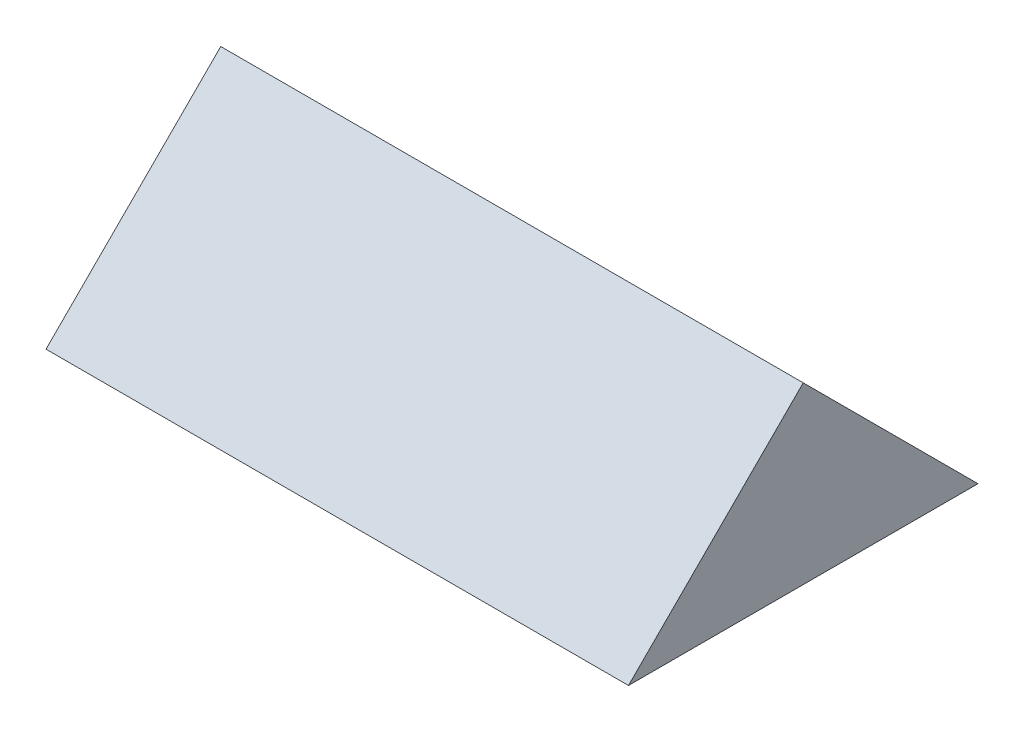
ISO-10303-21;
HEADER;
FILE_DESCRIPTION(('STEP AP214'),'2;1');
FILE_NAME('part.step','',(''),(''),'','','');
FILE_SCHEMA(('AUTOMOTIVE_DESIGN { 1 0 10303 214 1 1 1 1 }'));
ENDSEC;
DATA;
#1=APPLICATION_CONTEXT('core data for automotive mechanical design processes');
#2=APPLICATION_PROTOCOL_DEFINITION('international standard','automotive_design',2000,#1);
#3=PRODUCT_CONTEXT('',#1,'mechanical');
#4=PRODUCT('Part','Part','',(#3));
#5=PRODUCT_RELATED_PRODUCT_CATEGORY('part','',(#4));
#6=PRODUCT_DEFINITION_FORMATION('','',#4);
#7=PRODUCT_DEFINITION_CONTEXT('part definition',#1,'design');
#8=PRODUCT_DEFINITION('design','',#6,#7);
#9=PRODUCT_DEFINITION_SHAPE('','',#8);
#10=(LENGTH_UNIT() NAMED_UNIT(*) SI_UNIT(.MILLI.,.METRE.));
#11=(NAMED_UNIT(*) PLANE_ANGLE_UNIT() SI_UNIT($,.RADIAN.));
#12=(NAMED_UNIT(*) SI_UNIT($,.STERADIAN.) SOLID_ANGLE_UNIT());
#13=UNCERTAINTY_MEASURE_WITH_UNIT(LENGTH_MEASURE(1.E-05),#10,'distance_accuracy_value','');
#14=(GEOMETRIC_REPRESENTATION_CONTEXT(3) GLOBAL_UNCERTAINTY_ASSIGNED_CONTEXT((#13)) GLOBAL_UNIT_ASSIGNED_CONTEXT((#10,
#11,#12)) REPRESENTATION_CONTEXT('',''));
#15=CARTESIAN_POINT('',(0.,0.,0.));
#16=DIRECTION('',(0.,0.,1.));
#17=DIRECTION('',(1.,0.,0.));
#18=AXIS2_PLACEMENT_3D('',#15,#16,#17);
#19=CARTESIAN_POINT('',(12192.,0.,0.));
#20=DIRECTION('',(0.,1.,0.));
#21=DIRECTION('',(0.,0.,1.));
#22=AXIS2_PLACEMENT_3D('',#19,#20,#21);
#23=PLANE('',#22);
#24=DIRECTION('',(0.,0.,-1.));
#25=VECTOR('',#24,1.);
#26=CARTESIAN_POINT('',(0.,0.,0.));
#27=LINE('',#26,#25);
#28=CARTESIAN_POINT('',(0.,0.,0.));
#29=VERTEX_POINT('',#28);
#30=CARTESIAN_POINT('',(0.,0.,-7315.2));
#31=VERTEX_POINT('',#30);
#32=EDGE_CURVE('E133',#29,#31,#27,.T.);
#33=ORIENTED_EDGE('',*,*,#32,.T.);
#34=DIRECTION('',(-1.,0.,0.));
#35=VECTOR('',#34,1.);
#36=CARTESIAN_POINT('',(12192.,0.,-7315.2));
#37=LINE('',#36,#35);
#38=CARTESIAN_POINT('',(12192.,0.,-7315.2));
#39=VERTEX_POINT('',#38);
#40=EDGE_CURVE('E41',#39,#31,#37,.T.);
#41=ORIENTED_EDGE('',*,*,#40,.F.);
#42=DIRECTION('',(0.,0.,-1.));
#43=VECTOR('',#42,1.);
#44=CARTESIAN_POINT('',(12192.,0.,0.));
#45=LINE('',#44,#43);
#46=CARTESIAN_POINT('',(12192.,0.,0.));
#47=VERTEX_POINT('',#46);
#48=EDGE_CURVE('E79',#47,#39,#45,.T.);
#49=ORIENTED_EDGE('',*,*,#48,.F.);
#50=DIRECTION('',(-1.,0.,0.));
#51=VECTOR('',#50,1.);
#52=CARTESIAN_POINT('',(12192.,0.,0.));
#53=LINE('',#52,#51);
#54=EDGE_CURVE('E11',#47,#29,#53,.T.);
#55=ORIENTED_EDGE('',*,*,#54,.T.);
#56=EDGE_LOOP('',(#33,#41,#49,#55));
#57=FACE_BOUND('',#56,.T.);
#58=DIRECTION('',(0.,0.,-1.));
#59=VECTOR('',#58,1.);
#60=CARTESIAN_POINT('',(304.8,0.,0.));
#61=LINE('',#60,#59);
#62=CARTESIAN_POINT('',(304.8,0.,-431.052293811322));
#63=VERTEX_POINT('',#62);
#64=CARTESIAN_POINT('',(304.8,0.,-6884.14770618868));
#65=VERTEX_POINT('',#64);
#66=EDGE_CURVE('E102',#63,#65,#61,.T.);
#67=ORIENTED_EDGE('',*,*,#66,.F.);
#68=DIRECTION('',(-1.,0.,0.));
#69=VECTOR('',#68,1.);
#70=CARTESIAN_POINT('',(12192.,0.,-431.052293811322));
#71=LINE('',#70,#69);
#72=CARTESIAN_POINT('',(11887.2,0.,-431.052293811322));
#73=VERTEX_POINT('',#72);
#74=EDGE_CURVE('E114',#73,#63,#71,.T.);
#75=ORIENTED_EDGE('',*,*,#74,.F.);
#76=DIRECTION('',(0.,0.,-1.));
#77=VECTOR('',#76,1.);
#78=CARTESIAN_POINT('',(11887.2,0.,0.));
#79=LINE('',#78,#77);
#80=CARTESIAN_POINT('',(11887.2,0.,-6884.14770618868));
#81=VERTEX_POINT('',#80);
#82=EDGE_CURVE('E118',#73,#81,#79,.T.);
#83=ORIENTED_EDGE('',*,*,#82,.T.);
#84=DIRECTION('',(-1.,0.,0.));
#85=VECTOR('',#84,1.);
#86=CARTESIAN_POINT('',(12192.,0.,-6884.14770618868));
#87=LINE('',#86,#85);
#88=EDGE_CURVE('E110',#81,#65,#87,.T.);
#89=ORIENTED_EDGE('',*,*,#88,.T.);
#90=EDGE_LOOP('',(#67,#75,#83,#89));
#91=FACE_BOUND('',#90,.T.);
#92=ADVANCED_FACE('F33',(#57,#91),#23,.F.);
#93=CARTESIAN_POINT('',(12192.,3657.59999999996,-3657.6));
#94=DIRECTION('',(0.,-0.707106781186551,-0.707106781186544));
#95=DIRECTION('',(0.,0.707106781186544,-0.707106781186551));
#96=AXIS2_PLACEMENT_3D('',#93,#94,#95);
#97=PLANE('',#96);
#98=DIRECTION('',(0.,-0.707106781186544,0.707106781186551));
#99=VECTOR('',#98,1.);
#100=CARTESIAN_POINT('',(0.,3657.59999999996,-3657.6));
#101=LINE('',#100,#99);
#102=CARTESIAN_POINT('',(0.,3657.59999999996,-3657.6));
#103=VERTEX_POINT('',#102);
#104=EDGE_CURVE('E121',#103,#29,#101,.T.);
#105=ORIENTED_EDGE('',*,*,#104,.T.);
#106=ORIENTED_EDGE('',*,*,#54,.F.);
#107=DIRECTION('',(0.,-0.707106781186544,0.707106781186551));
#108=VECTOR('',#107,1.);
#109=CARTESIAN_POINT('',(12192.,3657.59999999996,-3657.6));
#110=LINE('',#109,#108);
#111=CARTESIAN_POINT('',(12192.,3657.59999999996,-3657.6));
#112=VERTEX_POINT('',#111);
#113=EDGE_CURVE('E126',#112,#47,#110,.T.);
#114=ORIENTED_EDGE('',*,*,#113,.F.);
#115=DIRECTION('',(-1.,0.,0.));
#116=VECTOR('',#115,1.);
#117=CARTESIAN_POINT('',(12192.,3657.59999999996,-3657.6));
#118=LINE('',#117,#116);
#119=EDGE_CURVE('E130',#112,#103,#118,.T.);
#120=ORIENTED_EDGE('',*,*,#119,.T.);
#121=EDGE_LOOP('',(#105,#106,#114,#120));
#122=FACE_BOUND('',#121,.T.);
#123=ADVANCED_FACE('F35',(#122),#97,.F.);
#124=CARTESIAN_POINT('',(12192.,0.,-7315.2));
#125=DIRECTION('',(0.,-0.707106781186551,0.707106781186544));
#126=DIRECTION('',(0.,-0.707106781186544,-0.707106781186551));
#127=AXIS2_PLACEMENT_3D('',#124,#125,#126);
#128=PLANE('',#127);
#129=DIRECTION('',(0.,0.707106781186544,0.707106781186551));
#130=VECTOR('',#129,1.);
#131=CARTESIAN_POINT('',(0.,0.,-7315.2));
#132=LINE('',#131,#130);
#133=EDGE_CURVE('E74',#31,#103,#132,.T.);
#134=ORIENTED_EDGE('',*,*,#133,.T.);
#135=ORIENTED_EDGE('',*,*,#119,.F.);
#136=DIRECTION('',(0.,0.707106781186544,0.707106781186551));
#137=VECTOR('',#136,1.);
#138=CARTESIAN_POINT('',(12192.,0.,-7315.2));
#139=LINE('',#138,#137);
#140=EDGE_CURVE('E57',#39,#112,#139,.T.);
#141=ORIENTED_EDGE('',*,*,#140,.F.);
#142=ORIENTED_EDGE('',*,*,#40,.T.);
#143=EDGE_LOOP('',(#134,#135,#141,#142));
#144=FACE_BOUND('',#143,.T.);
#145=ADVANCED_FACE('F136',(#144),#128,.F.);
#146=CARTESIAN_POINT('',(12192.,0.,0.));
#147=DIRECTION('',(-1.,0.,0.));
#148=DIRECTION('',(0.,0.,1.));
#149=AXIS2_PLACEMENT_3D('',#146,#147,#148);
#150=PLANE('',#149);
#151=ORIENTED_EDGE('',*,*,#113,.T.);
#152=ORIENTED_EDGE('',*,*,#48,.T.);
#153=ORIENTED_EDGE('',*,*,#140,.T.);
#154=EDGE_LOOP('',(#151,#152,#153));
#155=FACE_BOUND('',#154,.T.);
#156=ADVANCED_FACE('F143',(#155),#150,.F.);
#157=CARTESIAN_POINT('',(0.,0.,0.));
#158=DIRECTION('',(-1.,0.,0.));
#159=DIRECTION('',(0.,0.,1.));
#160=AXIS2_PLACEMENT_3D('',#157,#158,#159);
#161=PLANE('',#160);
#162=ORIENTED_EDGE('',*,*,#104,.F.);
#163=ORIENTED_EDGE('',*,*,#133,.F.);
#164=ORIENTED_EDGE('',*,*,#32,.F.);
#165=EDGE_LOOP('',(#162,#163,#164));
#166=FACE_BOUND('',#165,.T.);
#167=ADVANCED_FACE('F139',(#166),#161,.T.);
#168=CARTESIAN_POINT('',(12192.,3442.0738530943,-3873.12614690566));
#169=DIRECTION('',(0.,-0.707106781186551,-0.707106781186544));
#170=DIRECTION('',(0.,0.707106781186544,-0.707106781186551));
#171=AXIS2_PLACEMENT_3D('',#168,#169,#170);
#172=PLANE('',#171);
#173=DIRECTION('',(0.,-0.707106781186544,0.707106781186551));
#174=VECTOR('',#173,1.);
#175=CARTESIAN_POINT('',(304.8,-215.526146905661,-215.526146905659));
#176=LINE('',#175,#174);
#177=CARTESIAN_POINT('',(304.8,3226.54770618864,-3657.6));
#178=VERTEX_POINT('',#177);
#179=EDGE_CURVE('E100',#178,#63,#176,.T.);
#180=ORIENTED_EDGE('',*,*,#179,.F.);
#181=DIRECTION('',(-1.,0.,0.));
#182=VECTOR('',#181,1.);
#183=CARTESIAN_POINT('',(12192.,3226.54770618864,-3657.6));
#184=LINE('',#183,#182);
#185=CARTESIAN_POINT('',(11887.2,3226.54770618864,-3657.6));
#186=VERTEX_POINT('',#185);
#187=EDGE_CURVE('E106',#186,#178,#184,.T.);
#188=ORIENTED_EDGE('',*,*,#187,.F.);
#189=DIRECTION('',(0.,-0.707106781186544,0.707106781186551));
#190=VECTOR('',#189,1.);
#191=CARTESIAN_POINT('',(11887.2,-215.526146905661,-215.526146905659));
#192=LINE('',#191,#190);
#193=EDGE_CURVE('E48',#186,#73,#192,.T.);
#194=ORIENTED_EDGE('',*,*,#193,.T.);
#195=ORIENTED_EDGE('',*,*,#74,.T.);
#196=EDGE_LOOP('',(#180,#188,#194,#195));
#197=FACE_BOUND('',#196,.T.);
#198=ADVANCED_FACE('F112',(#197),#172,.T.);
#199=CARTESIAN_POINT('',(12192.,-215.526146905661,-7099.67385309434));
#200=DIRECTION('',(0.,-0.707106781186551,0.707106781186544));
#201=DIRECTION('',(0.,-0.707106781186544,-0.707106781186551));
#202=AXIS2_PLACEMENT_3D('',#199,#200,#201);
#203=PLANE('',#202);
#204=DIRECTION('',(0.,0.707106781186544,0.707106781186551));
#205=VECTOR('',#204,1.);
#206=CARTESIAN_POINT('',(304.8,3442.07385309434,-3442.0738530943));
#207=LINE('',#206,#205);
#208=EDGE_CURVE('E96',#65,#178,#207,.T.);
#209=ORIENTED_EDGE('',*,*,#208,.F.);
#210=ORIENTED_EDGE('',*,*,#88,.F.);
#211=DIRECTION('',(0.,0.707106781186544,0.707106781186551));
#212=VECTOR('',#211,1.);
#213=CARTESIAN_POINT('',(11887.2,3442.07385309434,-3442.0738530943));
#214=LINE('',#213,#212);
#215=EDGE_CURVE('E109',#81,#186,#214,.T.);
#216=ORIENTED_EDGE('',*,*,#215,.T.);
#217=ORIENTED_EDGE('',*,*,#187,.T.);
#218=EDGE_LOOP('',(#209,#210,#216,#217));
#219=FACE_BOUND('',#218,.T.);
#220=ADVANCED_FACE('F107',(#219),#203,.T.);
#221=CARTESIAN_POINT('',(11887.2,0.,0.));
#222=DIRECTION('',(-1.,0.,0.));
#223=DIRECTION('',(0.,0.,1.));
#224=AXIS2_PLACEMENT_3D('',#221,#222,#223);
#225=PLANE('',#224);
#226=ORIENTED_EDGE('',*,*,#193,.F.);
#227=ORIENTED_EDGE('',*,*,#215,.F.);
#228=ORIENTED_EDGE('',*,*,#82,.F.);
#229=EDGE_LOOP('',(#226,#227,#228));
#230=FACE_BOUND('',#229,.T.);
#231=ADVANCED_FACE('F159',(#230),#225,.T.);
#232=CARTESIAN_POINT('',(304.8,0.,0.));
#233=DIRECTION('',(-1.,0.,0.));
#234=DIRECTION('',(0.,0.,1.));
#235=AXIS2_PLACEMENT_3D('',#232,#233,#234);
#236=PLANE('',#235);
#237=ORIENTED_EDGE('',*,*,#179,.T.);
#238=ORIENTED_EDGE('',*,*,#66,.T.);
#239=ORIENTED_EDGE('',*,*,#208,.T.);
#240=EDGE_LOOP('',(#237,#238,#239));
#241=FACE_BOUND('',#240,.T.);
#242=ADVANCED_FACE('F98',(#241),#236,.F.);
#243=CLOSED_SHELL('',(#92,#123,#145,#156,#167,#198,#220,#231,#242));
#244=MANIFOLD_SOLID_BREP('B2',#243);
#245=ADVANCED_BREP_SHAPE_REPRESENTATION('',(#18,#244),#14);
#246=SHAPE_DEFINITION_REPRESENTATION(#9,#245);
ENDSEC;
END-ISO-10303-21;
